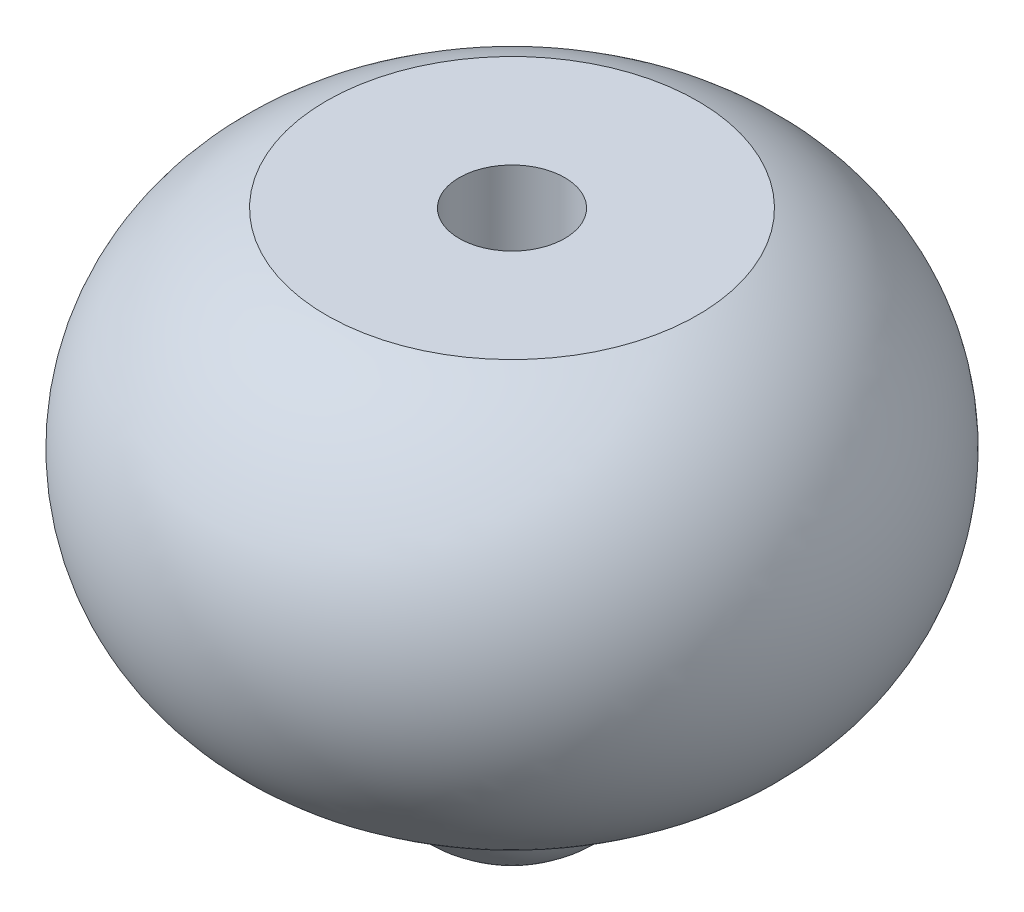
ISO-10303-21;
HEADER;
FILE_DESCRIPTION(('STEP AP214'),'2;1');
FILE_NAME('part.step','',(''),(''),'','','');
FILE_SCHEMA(('AUTOMOTIVE_DESIGN { 1 0 10303 214 1 1 1 1 }'));
ENDSEC;
DATA;
#1=APPLICATION_CONTEXT('core data for automotive mechanical design processes');
#2=APPLICATION_PROTOCOL_DEFINITION('international standard','automotive_design',2000,#1);
#3=PRODUCT_CONTEXT('',#1,'mechanical');
#4=PRODUCT('Part','Part','',(#3));
#5=PRODUCT_RELATED_PRODUCT_CATEGORY('part','',(#4));
#6=PRODUCT_DEFINITION_FORMATION('','',#4);
#7=PRODUCT_DEFINITION_CONTEXT('part definition',#1,'design');
#8=PRODUCT_DEFINITION('design','',#6,#7);
#9=PRODUCT_DEFINITION_SHAPE('','',#8);
#10=(LENGTH_UNIT() NAMED_UNIT(*) SI_UNIT(.MILLI.,.METRE.));
#11=(NAMED_UNIT(*) PLANE_ANGLE_UNIT() SI_UNIT($,.RADIAN.));
#12=(NAMED_UNIT(*) SI_UNIT($,.STERADIAN.) SOLID_ANGLE_UNIT());
#13=UNCERTAINTY_MEASURE_WITH_UNIT(LENGTH_MEASURE(1.E-05),#10,'distance_accuracy_value','');
#14=(GEOMETRIC_REPRESENTATION_CONTEXT(3) GLOBAL_UNCERTAINTY_ASSIGNED_CONTEXT((#13)) GLOBAL_UNIT_ASSIGNED_CONTEXT((#10,
#11,#12)) REPRESENTATION_CONTEXT('',''));
#15=CARTESIAN_POINT('',(0.,0.,0.));
#16=DIRECTION('',(0.,0.,1.));
#17=DIRECTION('',(1.,0.,0.));
#18=AXIS2_PLACEMENT_3D('',#15,#16,#17);
#19=CARTESIAN_POINT('',(67.1661766635726,49.2474975526693,0.));
#20=DIRECTION('',(-8.85802360017291E-06,0.999999999960768,0.));
#21=DIRECTION('',(-0.999999999960768,-8.85802360017291E-06,0.));
#22=AXIS2_PLACEMENT_3D('',#19,#20,#21);
#23=CONICAL_SURFACE('',#22,0.,1.5707874687713);
#24=CARTESIAN_POINT('',(67.1661766622581,49.2476459416471,0.));
#25=DIRECTION('',(8.85802360017291E-06,-0.999999999960768,0.));
#26=DIRECTION('',(0.999999999960768,8.85802360017291E-06,0.));
#27=AXIS2_PLACEMENT_3D('',#24,#25,#26);
#28=CIRCLE('',#27,16.7519284684178);
#29=CARTESIAN_POINT('',(50.4142481950115,49.2474975526693,0.));
#30=VERTEX_POINT('',#29);
#31=EDGE_CURVE('E39',#30,#30,#28,.T.);
#32=CARTESIAN_POINT('',(67.1661766631989,49.2475397390067,0.));
#33=DIRECTION('',(-8.85802360017291E-06,0.999999999960768,0.));
#34=DIRECTION('',(-0.999999999960768,-8.85802360017291E-06,0.));
#35=AXIS2_PLACEMENT_3D('',#32,#33,#34);
#36=CIRCLE('',#35,4.7625);
#37=CARTESIAN_POINT('',(62.4036766634097,49.2474975526693,0.));
#38=VERTEX_POINT('',#37);
#39=EDGE_CURVE('E35',#38,#38,#36,.T.);
#40=CARTESIAN_POINT('',(50.4142481950115,49.2474975526693,0.));
#41=CARTESIAN_POINT('',(50.5391380748907,49.2474975526693,0.));
#42=CARTESIAN_POINT('',(50.6640279547698,49.2474975526693,0.));
#43=CARTESIAN_POINT('',(50.9138077145281,49.2474975526693,0.));
#44=CARTESIAN_POINT('',(51.0386975944073,49.2474975526693,0.));
#45=CARTESIAN_POINT('',(51.2884773541656,49.2474975526693,0.));
#46=CARTESIAN_POINT('',(51.4133672340447,49.2474975526693,0.));
#47=CARTESIAN_POINT('',(51.663146993803,49.2474975526693,0.));
#48=CARTESIAN_POINT('',(51.7880368736822,49.2474975526693,0.));
#49=CARTESIAN_POINT('',(52.0378166334405,49.2474975526693,0.));
#50=CARTESIAN_POINT('',(52.1627065133196,49.2474975526693,0.));
#51=CARTESIAN_POINT('',(52.4124862730779,49.2474975526693,0.));
#52=CARTESIAN_POINT('',(52.5373761529571,49.2474975526693,0.));
#53=CARTESIAN_POINT('',(52.7871559127153,49.2474975526693,0.));
#54=CARTESIAN_POINT('',(52.9120457925945,49.2474975526693,0.));
#55=CARTESIAN_POINT('',(53.1618255523528,49.2474975526693,0.));
#56=CARTESIAN_POINT('',(53.2867154322319,49.2474975526693,0.));
#57=CARTESIAN_POINT('',(53.5364951919902,49.2474975526693,0.));
#58=CARTESIAN_POINT('',(53.6613850718694,49.2474975526693,0.));
#59=CARTESIAN_POINT('',(53.9111648316277,49.2474975526693,0.));
#60=CARTESIAN_POINT('',(54.0360547115068,49.2474975526693,0.));
#61=CARTESIAN_POINT('',(54.2858344712651,49.2474975526693,0.));
#62=CARTESIAN_POINT('',(54.4107243511443,49.2474975526693,0.));
#63=CARTESIAN_POINT('',(54.6605041109026,49.2474975526693,0.));
#64=CARTESIAN_POINT('',(54.7853939907817,49.2474975526693,0.));
#65=CARTESIAN_POINT('',(55.03517375054,49.2474975526693,0.));
#66=CARTESIAN_POINT('',(55.1600636304192,49.2474975526693,0.));
#67=CARTESIAN_POINT('',(55.4098433901774,49.2474975526693,0.));
#68=CARTESIAN_POINT('',(55.5347332700566,49.2474975526693,0.));
#69=CARTESIAN_POINT('',(55.7845130298149,49.2474975526693,0.));
#70=CARTESIAN_POINT('',(55.909402909694,49.2474975526693,0.));
#71=CARTESIAN_POINT('',(56.1591826694523,49.2474975526693,0.));
#72=CARTESIAN_POINT('',(56.2840725493315,49.2474975526693,0.));
#73=CARTESIAN_POINT('',(56.5338523090898,49.2474975526693,0.));
#74=CARTESIAN_POINT('',(56.6587421889689,49.2474975526693,0.));
#75=CARTESIAN_POINT('',(56.9085219487272,49.2474975526693,0.));
#76=CARTESIAN_POINT('',(57.0334118286064,49.2474975526693,0.));
#77=CARTESIAN_POINT('',(57.2831915883646,49.2474975526693,0.));
#78=CARTESIAN_POINT('',(57.4080814682438,49.2474975526693,0.));
#79=CARTESIAN_POINT('',(57.6578612280021,49.2474975526693,0.));
#80=CARTESIAN_POINT('',(57.7827511078812,49.2474975526693,0.));
#81=CARTESIAN_POINT('',(58.0325308676395,49.2474975526693,0.));
#82=CARTESIAN_POINT('',(58.1574207475187,49.2474975526693,0.));
#83=CARTESIAN_POINT('',(58.407200507277,49.2474975526693,0.));
#84=CARTESIAN_POINT('',(58.5320903871561,49.2474975526693,0.));
#85=CARTESIAN_POINT('',(58.7818701469144,49.2474975526693,0.));
#86=CARTESIAN_POINT('',(58.9067600267936,49.2474975526693,0.));
#87=CARTESIAN_POINT('',(59.1565397865519,49.2474975526693,0.));
#88=CARTESIAN_POINT('',(59.281429666431,49.2474975526693,0.));
#89=CARTESIAN_POINT('',(59.5312094261893,49.2474975526693,0.));
#90=CARTESIAN_POINT('',(59.6560993060685,49.2474975526693,0.));
#91=CARTESIAN_POINT('',(59.9058790658267,49.2474975526693,0.));
#92=CARTESIAN_POINT('',(60.0307689457059,49.2474975526693,0.));
#93=CARTESIAN_POINT('',(60.2805487054642,49.2474975526693,0.));
#94=CARTESIAN_POINT('',(60.4054385853433,49.2474975526693,0.));
#95=CARTESIAN_POINT('',(60.6552183451016,49.2474975526693,0.));
#96=CARTESIAN_POINT('',(60.7801082249808,49.2474975526693,0.));
#97=CARTESIAN_POINT('',(61.0298879847391,49.2474975526693,0.));
#98=CARTESIAN_POINT('',(61.1547778646182,49.2474975526693,0.));
#99=CARTESIAN_POINT('',(61.4045576243765,49.2474975526693,0.));
#100=CARTESIAN_POINT('',(61.5294475042557,49.2474975526693,0.));
#101=CARTESIAN_POINT('',(61.7792272640139,49.2474975526693,0.));
#102=CARTESIAN_POINT('',(61.9041171438931,49.2474975526693,0.));
#103=CARTESIAN_POINT('',(62.1538969036514,49.2474975526693,0.));
#104=CARTESIAN_POINT('',(62.2787867835305,49.2474975526693,0.));
#105=CARTESIAN_POINT('',(62.4036766634097,49.2474975526693,0.));
#106=B_SPLINE_CURVE_WITH_KNOTS('',3,(#40,#41,#42,#43,#44,#45,#46,#47,#48,#49,#50,#51,#52,#53,
#54,#55,#56,#57,#58,#59,#60,#61,#62,#63,#64,#65,#66,#67,#68,#69,#70,#71,#72,#73,#74,#75,#76,#77,
#78,#79,#80,#81,#82,#83,#84,#85,#86,#87,#88,#89,#90,#91,#92,#93,#94,#95,#96,#97,#98,#99,#100,
#101,#102,#103,#104,#105),.UNSPECIFIED.,.F.,.F.,(4,2,2,2,2,2,2,2,2,2,2,2,2,2,2,2,2,2,2,2,2,2,2,
2,2,2,2,2,2,2,2,2,4),(0.,0.374669639637441,0.749339279274897,1.12400891891233,1.49867855854977,
1.87334819818721,2.24801783782466,2.6226874774621,2.99735711709954,3.37202675673699,
3.74669639637443,4.12136603601186,4.49603567564931,4.87070531528675,5.24537495492419,
5.62004459456163,5.99471423419908,6.36938387383652,6.74405351347396,7.1187231531114,
7.49339279274884,7.86806243238629,8.24273207202373,8.61740171166116,8.99207135129861,
9.36674099093605,9.74141063057349,10.1160802702109,10.4907499098484,10.8654195494858,
11.2400891891233,11.6147588287607,11.9894284683981),.UNSPECIFIED.);
#107=EDGE_CURVE('BSEAM31',#30,#38,#106,.T.);
#108=ORIENTED_EDGE('',*,*,#31,.F.);
#109=ORIENTED_EDGE('',*,*,#39,.F.);
#110=ORIENTED_EDGE('',*,*,#107,.T.);
#111=ORIENTED_EDGE('',*,*,#107,.F.);
#112=EDGE_LOOP('',(#108,#110,#109,#111));
#113=FACE_BOUND('',#112,.T.);
#114=ADVANCED_FACE('F31',(#113),#23,.F.);
#115=CARTESIAN_POINT('',(67.1665152947845,11.0187427853148,0.));
#116=DIRECTION('',(8.85802360017291E-06,-0.999999999960768,0.));
#117=DIRECTION('',(-0.999999999960768,-8.85802360017291E-06,0.));
#118=AXIS2_PLACEMENT_3D('',#115,#116,#117);
#119=SPHERICAL_SURFACE('',#118,10.7535876036429);
#120=CARTESIAN_POINT('',(67.1665203671143,10.4461173301556,0.));
#121=DIRECTION('',(8.85802360017291E-06,-0.999999999960768,0.));
#122=DIRECTION('',(0.999999999960768,8.85802360017291E-06,0.));
#123=AXIS2_PLACEMENT_3D('',#120,#121,#122);
#124=CIRCLE('',#123,10.7383307099986);
#125=CARTESIAN_POINT('',(77.9048510766916,10.4462124505424,0.));
#126=VERTEX_POINT('',#125);
#127=EDGE_CURVE('E10',#126,#126,#124,.T.);
#128=ORIENTED_EDGE('',*,*,#127,.T.);
#129=EDGE_LOOP('',(#128));
#130=FACE_BOUND('',#129,.T.);
#131=ADVANCED_FACE('F33',(#130),#119,.T.);
#132=CARTESIAN_POINT('',(67.1663429551241,30.4745117168362,0.));
#133=DIRECTION('',(8.85802360017291E-06,-0.999999999960768,0.));
#134=DIRECTION('',(0.999999999960768,8.85802360017291E-06,0.));
#135=AXIS2_PLACEMENT_3D('',#132,#133,#134);
#136=DEGENERATE_TOROIDAL_SURFACE('',#135,9.69547287403395,20.0555262759651,.T.);
#137=ORIENTED_EDGE('',*,*,#127,.F.);
#138=EDGE_LOOP('',(#137));
#139=FACE_BOUND('',#138,.T.);
#140=ORIENTED_EDGE('',*,*,#31,.T.);
#141=EDGE_LOOP('',(#140));
#142=FACE_BOUND('',#141,.T.);
#143=ADVANCED_FACE('F60',(#139,#142),#136,.T.);
#144=CARTESIAN_POINT('',(67.1664016560576,23.8476459426436,0.));
#145=DIRECTION('',(-8.85802360035428E-06,0.999999999960768,0.));
#146=DIRECTION('',(-0.999999999960768,-8.85802360035428E-06,0.));
#147=AXIS2_PLACEMENT_3D('',#144,#145,#146);
#148=CYLINDRICAL_SURFACE('',#147,4.7625);
#149=CARTESIAN_POINT('',(67.1664016560576,23.8476459426436,0.));
#150=DIRECTION('',(8.85802360035428E-06,-0.999999999960768,0.));
#151=DIRECTION('',(0.999999999960768,8.85802360035428E-06,0.));
#152=AXIS2_PLACEMENT_3D('',#149,#150,#151);
#153=CIRCLE('',#152,4.7625);
#154=CARTESIAN_POINT('',(71.9289016558707,23.847688128981,0.));
#155=VERTEX_POINT('',#154);
#156=EDGE_CURVE('E45',#155,#155,#153,.T.);
#157=ORIENTED_EDGE('',*,*,#156,.T.);
#158=EDGE_LOOP('',(#157));
#159=FACE_BOUND('',#158,.T.);
#160=ORIENTED_EDGE('',*,*,#39,.T.);
#161=EDGE_LOOP('',(#160));
#162=FACE_BOUND('',#161,.T.);
#163=ADVANCED_FACE('F52',(#159,#162),#148,.F.);
#164=CARTESIAN_POINT('',(67.1664016560576,23.8476459426436,0.));
#165=DIRECTION('',(8.85802360035428E-06,-0.999999999960768,0.));
#166=DIRECTION('',(0.999999999960768,8.85802360035428E-06,0.));
#167=AXIS2_PLACEMENT_3D('',#164,#165,#166);
#168=PLANE('',#167);
#169=ORIENTED_EDGE('',*,*,#156,.F.);
#170=EDGE_LOOP('',(#169));
#171=FACE_BOUND('',#170,.T.);
#172=ADVANCED_FACE('F69',(#171),#168,.F.);
#173=CLOSED_SHELL('',(#114,#131,#143,#163,#172));
#174=MANIFOLD_SOLID_BREP('B2',#173);
#175=ADVANCED_BREP_SHAPE_REPRESENTATION('',(#18,#174),#14);
#176=SHAPE_DEFINITION_REPRESENTATION(#9,#175);
ENDSEC;
END-ISO-10303-21;
